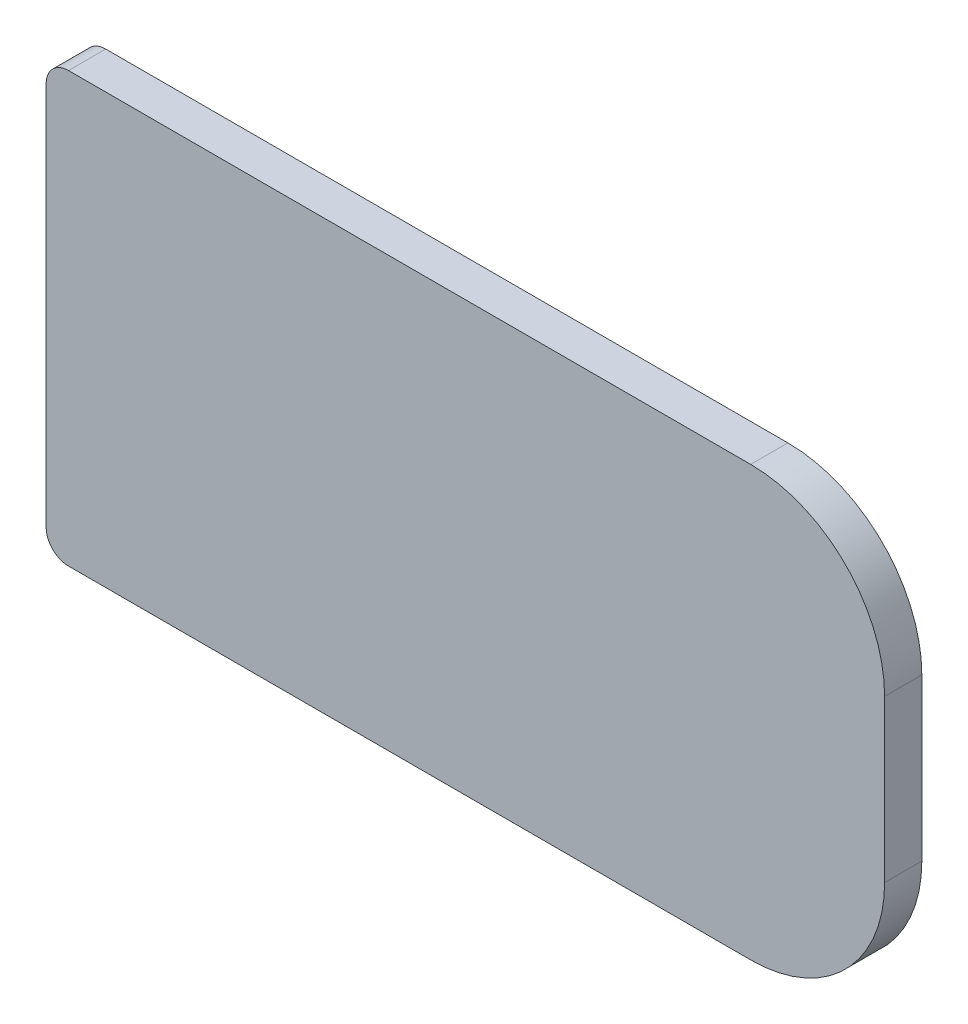
ISO-10303-21;
HEADER;
FILE_DESCRIPTION(('STEP AP214'),'2;1');
FILE_NAME('part.step','',(''),(''),'','','');
FILE_SCHEMA(('AUTOMOTIVE_DESIGN { 1 0 10303 214 1 1 1 1 }'));
ENDSEC;
DATA;
#1=APPLICATION_CONTEXT('core data for automotive mechanical design processes');
#2=APPLICATION_PROTOCOL_DEFINITION('international standard','automotive_design',2000,#1);
#3=PRODUCT_CONTEXT('',#1,'mechanical');
#4=PRODUCT('Part','Part','',(#3));
#5=PRODUCT_RELATED_PRODUCT_CATEGORY('part','',(#4));
#6=PRODUCT_DEFINITION_FORMATION('','',#4);
#7=PRODUCT_DEFINITION_CONTEXT('part definition',#1,'design');
#8=PRODUCT_DEFINITION('design','',#6,#7);
#9=PRODUCT_DEFINITION_SHAPE('','',#8);
#10=(LENGTH_UNIT() NAMED_UNIT(*) SI_UNIT(.MILLI.,.METRE.));
#11=(NAMED_UNIT(*) PLANE_ANGLE_UNIT() SI_UNIT($,.RADIAN.));
#12=(NAMED_UNIT(*) SI_UNIT($,.STERADIAN.) SOLID_ANGLE_UNIT());
#13=UNCERTAINTY_MEASURE_WITH_UNIT(LENGTH_MEASURE(1.E-05),#10,'distance_accuracy_value','');
#14=(GEOMETRIC_REPRESENTATION_CONTEXT(3) GLOBAL_UNCERTAINTY_ASSIGNED_CONTEXT((#13)) GLOBAL_UNIT_ASSIGNED_CONTEXT((#10,
#11,#12)) REPRESENTATION_CONTEXT('',''));
#15=CARTESIAN_POINT('',(0.,0.,0.));
#16=DIRECTION('',(0.,0.,1.));
#17=DIRECTION('',(1.,0.,0.));
#18=AXIS2_PLACEMENT_3D('',#15,#16,#17);
#19=CARTESIAN_POINT('',(-32.,15.5,3.));
#20=DIRECTION('',(0.,0.,-1.));
#21=DIRECTION('',(-1.,0.,0.));
#22=AXIS2_PLACEMENT_3D('',#19,#20,#21);
#23=CYLINDRICAL_SURFACE('',#22,1.8);
#24=CARTESIAN_POINT('',(-32.,15.5,0.));
#25=DIRECTION('',(0.,0.,1.));
#26=DIRECTION('',(1.,0.,0.));
#27=AXIS2_PLACEMENT_3D('',#24,#25,#26);
#28=CIRCLE('',#27,1.8);
#29=CARTESIAN_POINT('',(-32.,17.3,0.));
#30=VERTEX_POINT('',#29);
#31=CARTESIAN_POINT('',(-33.8,15.5,0.));
#32=VERTEX_POINT('',#31);
#33=EDGE_CURVE('E130',#30,#32,#28,.T.);
#34=ORIENTED_EDGE('',*,*,#33,.T.);
#35=DIRECTION('',(0.,0.,-1.));
#36=VECTOR('',#35,1.);
#37=CARTESIAN_POINT('',(-33.8,15.5,3.));
#38=LINE('',#37,#36);
#39=CARTESIAN_POINT('',(-33.8,15.5,3.));
#40=VERTEX_POINT('',#39);
#41=EDGE_CURVE('E11',#40,#32,#38,.T.);
#42=ORIENTED_EDGE('',*,*,#41,.F.);
#43=CARTESIAN_POINT('',(-32.,15.5,3.));
#44=DIRECTION('',(0.,0.,1.));
#45=DIRECTION('',(1.,0.,0.));
#46=AXIS2_PLACEMENT_3D('',#43,#44,#45);
#47=CIRCLE('',#46,1.8);
#48=CARTESIAN_POINT('',(-32.,17.3,3.));
#49=VERTEX_POINT('',#48);
#50=EDGE_CURVE('E144',#49,#40,#47,.T.);
#51=ORIENTED_EDGE('',*,*,#50,.F.);
#52=DIRECTION('',(0.,0.,-1.));
#53=VECTOR('',#52,1.);
#54=CARTESIAN_POINT('',(-32.,17.3,3.));
#55=LINE('',#54,#53);
#56=EDGE_CURVE('E126',#49,#30,#55,.T.);
#57=ORIENTED_EDGE('',*,*,#56,.T.);
#58=EDGE_LOOP('',(#34,#42,#51,#57));
#59=FACE_BOUND('',#58,.T.);
#60=ADVANCED_FACE('F34',(#59),#23,.T.);
#61=CARTESIAN_POINT('',(-33.8,15.5,3.));
#62=DIRECTION('',(1.,0.,0.));
#63=DIRECTION('',(0.,0.,-1.));
#64=AXIS2_PLACEMENT_3D('',#61,#62,#63);
#65=PLANE('',#64);
#66=DIRECTION('',(0.,-1.,0.));
#67=VECTOR('',#66,1.);
#68=CARTESIAN_POINT('',(-33.8,15.5,0.));
#69=LINE('',#68,#67);
#70=CARTESIAN_POINT('',(-33.8,-15.5,0.));
#71=VERTEX_POINT('',#70);
#72=EDGE_CURVE('E133',#32,#71,#69,.T.);
#73=ORIENTED_EDGE('',*,*,#72,.T.);
#74=DIRECTION('',(0.,0.,-1.));
#75=VECTOR('',#74,1.);
#76=CARTESIAN_POINT('',(-33.8,-15.5,3.));
#77=LINE('',#76,#75);
#78=CARTESIAN_POINT('',(-33.8,-15.5,3.));
#79=VERTEX_POINT('',#78);
#80=EDGE_CURVE('E42',#79,#71,#77,.T.);
#81=ORIENTED_EDGE('',*,*,#80,.F.);
#82=DIRECTION('',(0.,-1.,0.));
#83=VECTOR('',#82,1.);
#84=CARTESIAN_POINT('',(-33.8,15.5,3.));
#85=LINE('',#84,#83);
#86=EDGE_CURVE('E93',#40,#79,#85,.T.);
#87=ORIENTED_EDGE('',*,*,#86,.F.);
#88=ORIENTED_EDGE('',*,*,#41,.T.);
#89=EDGE_LOOP('',(#73,#81,#87,#88));
#90=FACE_BOUND('',#89,.T.);
#91=ADVANCED_FACE('F179',(#90),#65,.F.);
#92=CARTESIAN_POINT('',(-32.,-15.5,3.));
#93=DIRECTION('',(0.,0.,-1.));
#94=DIRECTION('',(-1.,0.,0.));
#95=AXIS2_PLACEMENT_3D('',#92,#93,#94);
#96=CYLINDRICAL_SURFACE('',#95,1.8);
#97=CARTESIAN_POINT('',(-32.,-15.5,0.));
#98=DIRECTION('',(0.,0.,1.));
#99=DIRECTION('',(1.,0.,0.));
#100=AXIS2_PLACEMENT_3D('',#97,#98,#99);
#101=CIRCLE('',#100,1.8);
#102=CARTESIAN_POINT('',(-32.,-17.3,0.));
#103=VERTEX_POINT('',#102);
#104=EDGE_CURVE('E135',#71,#103,#101,.T.);
#105=ORIENTED_EDGE('',*,*,#104,.T.);
#106=DIRECTION('',(0.,0.,-1.));
#107=VECTOR('',#106,1.);
#108=CARTESIAN_POINT('',(-32.,-17.3,3.));
#109=LINE('',#108,#107);
#110=CARTESIAN_POINT('',(-32.,-17.3,3.));
#111=VERTEX_POINT('',#110);
#112=EDGE_CURVE('E151',#111,#103,#109,.T.);
#113=ORIENTED_EDGE('',*,*,#112,.F.);
#114=CARTESIAN_POINT('',(-32.,-15.5,3.));
#115=DIRECTION('',(0.,0.,1.));
#116=DIRECTION('',(1.,0.,0.));
#117=AXIS2_PLACEMENT_3D('',#114,#115,#116);
#118=CIRCLE('',#117,1.8);
#119=EDGE_CURVE('E159',#79,#111,#118,.T.);
#120=ORIENTED_EDGE('',*,*,#119,.F.);
#121=ORIENTED_EDGE('',*,*,#80,.T.);
#122=EDGE_LOOP('',(#105,#113,#120,#121));
#123=FACE_BOUND('',#122,.T.);
#124=ADVANCED_FACE('F157',(#123),#96,.T.);
#125=CARTESIAN_POINT('',(-32.,-17.3,3.));
#126=DIRECTION('',(0.,1.,0.));
#127=DIRECTION('',(-1.,0.,0.));
#128=AXIS2_PLACEMENT_3D('',#125,#126,#127);
#129=PLANE('',#128);
#130=DIRECTION('',(1.,0.,0.));
#131=VECTOR('',#130,1.);
#132=CARTESIAN_POINT('',(-32.,-17.3,0.));
#133=LINE('',#132,#131);
#134=CARTESIAN_POINT('',(23.,-17.3,0.));
#135=VERTEX_POINT('',#134);
#136=EDGE_CURVE('E137',#103,#135,#133,.T.);
#137=ORIENTED_EDGE('',*,*,#136,.T.);
#138=DIRECTION('',(0.,0.,-1.));
#139=VECTOR('',#138,1.);
#140=CARTESIAN_POINT('',(23.,-17.3,3.));
#141=LINE('',#140,#139);
#142=CARTESIAN_POINT('',(23.,-17.3,3.));
#143=VERTEX_POINT('',#142);
#144=EDGE_CURVE('E148',#143,#135,#141,.T.);
#145=ORIENTED_EDGE('',*,*,#144,.F.);
#146=DIRECTION('',(1.,0.,0.));
#147=VECTOR('',#146,1.);
#148=CARTESIAN_POINT('',(-32.,-17.3,3.));
#149=LINE('',#148,#147);
#150=EDGE_CURVE('E171',#111,#143,#149,.T.);
#151=ORIENTED_EDGE('',*,*,#150,.F.);
#152=ORIENTED_EDGE('',*,*,#112,.T.);
#153=EDGE_LOOP('',(#137,#145,#151,#152));
#154=FACE_BOUND('',#153,.T.);
#155=ADVANCED_FACE('F167',(#154),#129,.F.);
#156=CARTESIAN_POINT('',(23.,-6.50000000000001,3.));
#157=DIRECTION('',(0.,0.,-1.));
#158=DIRECTION('',(-1.,0.,0.));
#159=AXIS2_PLACEMENT_3D('',#156,#157,#158);
#160=CYLINDRICAL_SURFACE('',#159,10.8);
#161=CARTESIAN_POINT('',(23.,-6.50000000000001,0.));
#162=DIRECTION('',(0.,0.,1.));
#163=DIRECTION('',(1.,0.,0.));
#164=AXIS2_PLACEMENT_3D('',#161,#162,#163);
#165=CIRCLE('',#164,10.8);
#166=CARTESIAN_POINT('',(33.8,-6.50000000000001,0.));
#167=VERTEX_POINT('',#166);
#168=EDGE_CURVE('E139',#135,#167,#165,.T.);
#169=ORIENTED_EDGE('',*,*,#168,.T.);
#170=DIRECTION('',(0.,0.,-1.));
#171=VECTOR('',#170,1.);
#172=CARTESIAN_POINT('',(33.8,-6.50000000000001,3.));
#173=LINE('',#172,#171);
#174=CARTESIAN_POINT('',(33.8,-6.50000000000001,3.));
#175=VERTEX_POINT('',#174);
#176=EDGE_CURVE('E121',#175,#167,#173,.T.);
#177=ORIENTED_EDGE('',*,*,#176,.F.);
#178=CARTESIAN_POINT('',(23.,-6.50000000000001,3.));
#179=DIRECTION('',(0.,0.,1.));
#180=DIRECTION('',(1.,0.,0.));
#181=AXIS2_PLACEMENT_3D('',#178,#179,#180);
#182=CIRCLE('',#181,10.8);
#183=EDGE_CURVE('E112',#143,#175,#182,.T.);
#184=ORIENTED_EDGE('',*,*,#183,.F.);
#185=ORIENTED_EDGE('',*,*,#144,.T.);
#186=EDGE_LOOP('',(#169,#177,#184,#185));
#187=FACE_BOUND('',#186,.T.);
#188=ADVANCED_FACE('F170',(#187),#160,.T.);
#189=CARTESIAN_POINT('',(33.8,-6.50000000000001,3.));
#190=DIRECTION('',(-1.,0.,0.));
#191=DIRECTION('',(0.,0.,1.));
#192=AXIS2_PLACEMENT_3D('',#189,#190,#191);
#193=PLANE('',#192);
#194=DIRECTION('',(0.,1.,0.));
#195=VECTOR('',#194,1.);
#196=CARTESIAN_POINT('',(33.8,-6.50000000000001,0.));
#197=LINE('',#196,#195);
#198=CARTESIAN_POINT('',(33.8,6.49999999999999,0.));
#199=VERTEX_POINT('',#198);
#200=EDGE_CURVE('E120',#167,#199,#197,.T.);
#201=ORIENTED_EDGE('',*,*,#200,.T.);
#202=DIRECTION('',(0.,0.,-1.));
#203=VECTOR('',#202,1.);
#204=CARTESIAN_POINT('',(33.8,6.49999999999999,3.));
#205=LINE('',#204,#203);
#206=CARTESIAN_POINT('',(33.8,6.49999999999999,3.));
#207=VERTEX_POINT('',#206);
#208=EDGE_CURVE('E117',#207,#199,#205,.T.);
#209=ORIENTED_EDGE('',*,*,#208,.F.);
#210=DIRECTION('',(0.,1.,0.));
#211=VECTOR('',#210,1.);
#212=CARTESIAN_POINT('',(33.8,-6.50000000000001,3.));
#213=LINE('',#212,#211);
#214=EDGE_CURVE('E106',#175,#207,#213,.T.);
#215=ORIENTED_EDGE('',*,*,#214,.F.);
#216=ORIENTED_EDGE('',*,*,#176,.T.);
#217=EDGE_LOOP('',(#201,#209,#215,#216));
#218=FACE_BOUND('',#217,.T.);
#219=ADVANCED_FACE('F118',(#218),#193,.F.);
#220=CARTESIAN_POINT('',(23.,6.49999999999999,3.));
#221=DIRECTION('',(0.,0.,-1.));
#222=DIRECTION('',(-1.,0.,0.));
#223=AXIS2_PLACEMENT_3D('',#220,#221,#222);
#224=CYLINDRICAL_SURFACE('',#223,10.8);
#225=CARTESIAN_POINT('',(23.,6.49999999999999,0.));
#226=DIRECTION('',(0.,0.,1.));
#227=DIRECTION('',(1.,0.,0.));
#228=AXIS2_PLACEMENT_3D('',#225,#226,#227);
#229=CIRCLE('',#228,10.8);
#230=CARTESIAN_POINT('',(23.,17.3,0.));
#231=VERTEX_POINT('',#230);
#232=EDGE_CURVE('E79',#199,#231,#229,.T.);
#233=ORIENTED_EDGE('',*,*,#232,.T.);
#234=DIRECTION('',(0.,0.,-1.));
#235=VECTOR('',#234,1.);
#236=CARTESIAN_POINT('',(23.,17.3,3.));
#237=LINE('',#236,#235);
#238=CARTESIAN_POINT('',(23.,17.3,3.));
#239=VERTEX_POINT('',#238);
#240=EDGE_CURVE('E122',#239,#231,#237,.T.);
#241=ORIENTED_EDGE('',*,*,#240,.F.);
#242=CARTESIAN_POINT('',(23.,6.49999999999999,3.));
#243=DIRECTION('',(0.,0.,1.));
#244=DIRECTION('',(1.,0.,0.));
#245=AXIS2_PLACEMENT_3D('',#242,#243,#244);
#246=CIRCLE('',#245,10.8);
#247=EDGE_CURVE('E110',#207,#239,#246,.T.);
#248=ORIENTED_EDGE('',*,*,#247,.F.);
#249=ORIENTED_EDGE('',*,*,#208,.T.);
#250=EDGE_LOOP('',(#233,#241,#248,#249));
#251=FACE_BOUND('',#250,.T.);
#252=ADVANCED_FACE('F124',(#251),#224,.T.);
#253=CARTESIAN_POINT('',(23.,17.3,3.));
#254=DIRECTION('',(0.,-1.,0.));
#255=DIRECTION('',(1.,0.,0.));
#256=AXIS2_PLACEMENT_3D('',#253,#254,#255);
#257=PLANE('',#256);
#258=DIRECTION('',(-1.,0.,0.));
#259=VECTOR('',#258,1.);
#260=CARTESIAN_POINT('',(23.,17.3,0.));
#261=LINE('',#260,#259);
#262=EDGE_CURVE('E85',#231,#30,#261,.T.);
#263=ORIENTED_EDGE('',*,*,#262,.T.);
#264=ORIENTED_EDGE('',*,*,#56,.F.);
#265=DIRECTION('',(-1.,0.,0.));
#266=VECTOR('',#265,1.);
#267=CARTESIAN_POINT('',(23.,17.3,3.));
#268=LINE('',#267,#266);
#269=EDGE_CURVE('E50',#239,#49,#268,.T.);
#270=ORIENTED_EDGE('',*,*,#269,.F.);
#271=ORIENTED_EDGE('',*,*,#240,.T.);
#272=EDGE_LOOP('',(#263,#264,#270,#271));
#273=FACE_BOUND('',#272,.T.);
#274=ADVANCED_FACE('F195',(#273),#257,.F.);
#275=CARTESIAN_POINT('',(-32.,15.5,3.));
#276=DIRECTION('',(0.,0.,1.));
#277=DIRECTION('',(1.,0.,0.));
#278=AXIS2_PLACEMENT_3D('',#275,#276,#277);
#279=PLANE('',#278);
#280=ORIENTED_EDGE('',*,*,#50,.T.);
#281=ORIENTED_EDGE('',*,*,#86,.T.);
#282=ORIENTED_EDGE('',*,*,#119,.T.);
#283=ORIENTED_EDGE('',*,*,#150,.T.);
#284=ORIENTED_EDGE('',*,*,#183,.T.);
#285=ORIENTED_EDGE('',*,*,#214,.T.);
#286=ORIENTED_EDGE('',*,*,#247,.T.);
#287=ORIENTED_EDGE('',*,*,#269,.T.);
#288=EDGE_LOOP('',(#280,#281,#282,#283,#284,#285,#286,#287));
#289=FACE_BOUND('',#288,.T.);
#290=ADVANCED_FACE('F108',(#289),#279,.T.);
#291=CARTESIAN_POINT('',(-32.,15.5,0.));
#292=DIRECTION('',(0.,0.,1.));
#293=DIRECTION('',(1.,0.,0.));
#294=AXIS2_PLACEMENT_3D('',#291,#292,#293);
#295=PLANE('',#294);
#296=ORIENTED_EDGE('',*,*,#33,.F.);
#297=ORIENTED_EDGE('',*,*,#262,.F.);
#298=ORIENTED_EDGE('',*,*,#232,.F.);
#299=ORIENTED_EDGE('',*,*,#200,.F.);
#300=ORIENTED_EDGE('',*,*,#168,.F.);
#301=ORIENTED_EDGE('',*,*,#136,.F.);
#302=ORIENTED_EDGE('',*,*,#104,.F.);
#303=ORIENTED_EDGE('',*,*,#72,.F.);
#304=EDGE_LOOP('',(#296,#297,#298,#299,#300,#301,#302,#303));
#305=FACE_BOUND('',#304,.T.);
#306=ADVANCED_FACE('F163',(#305),#295,.F.);
#307=CLOSED_SHELL('',(#60,#91,#124,#155,#188,#219,#252,#274,#290,#306));
#308=MANIFOLD_SOLID_BREP('B2',#307);
#309=ADVANCED_BREP_SHAPE_REPRESENTATION('',(#18,#308),#14);
#310=SHAPE_DEFINITION_REPRESENTATION(#9,#309);
ENDSEC;
END-ISO-10303-21;
